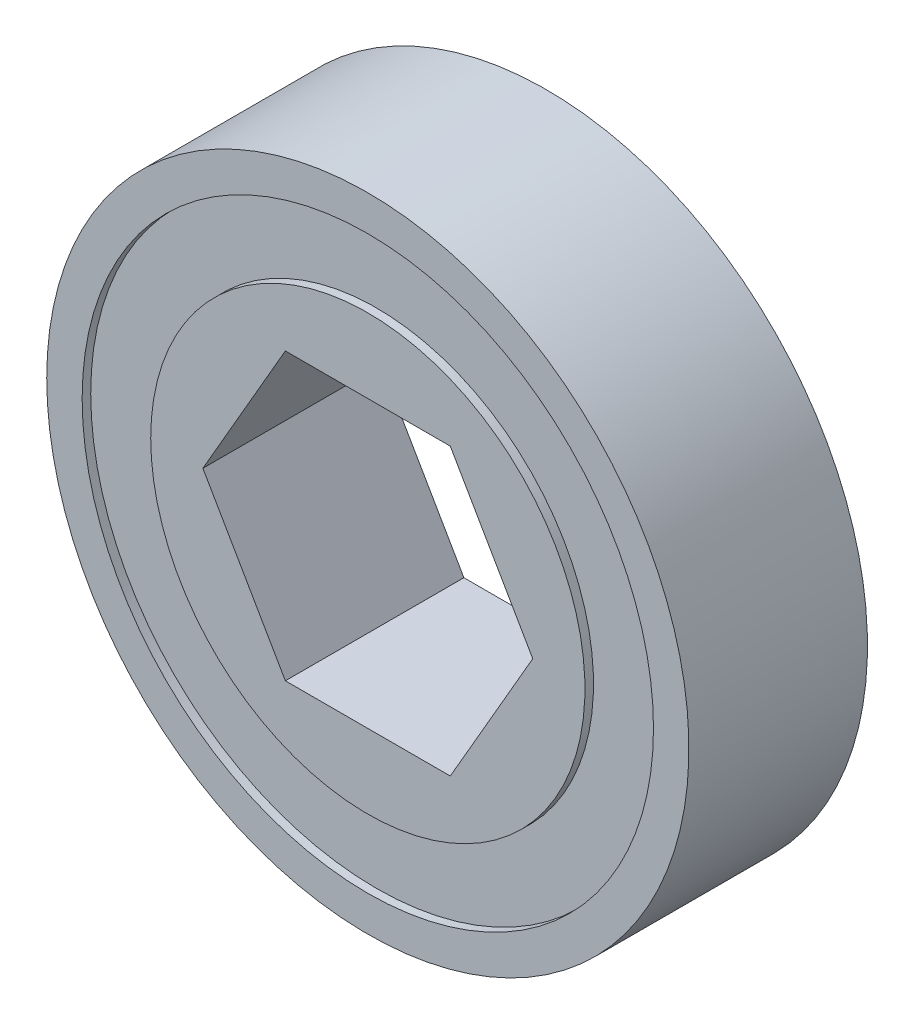
ISO-10303-21;
HEADER;
FILE_DESCRIPTION(('STEP AP214'),'2;1');
FILE_NAME('part.step','',(''),(''),'','','');
FILE_SCHEMA(('AUTOMOTIVE_DESIGN { 1 0 10303 214 1 1 1 1 }'));
ENDSEC;
DATA;
#1=APPLICATION_CONTEXT('core data for automotive mechanical design processes');
#2=APPLICATION_PROTOCOL_DEFINITION('international standard','automotive_design',2000,#1);
#3=PRODUCT_CONTEXT('',#1,'mechanical');
#4=PRODUCT('Part','Part','',(#3));
#5=PRODUCT_RELATED_PRODUCT_CATEGORY('part','',(#4));
#6=PRODUCT_DEFINITION_FORMATION('','',#4);
#7=PRODUCT_DEFINITION_CONTEXT('part definition',#1,'design');
#8=PRODUCT_DEFINITION('design','',#6,#7);
#9=PRODUCT_DEFINITION_SHAPE('','',#8);
#10=(LENGTH_UNIT() NAMED_UNIT(*) SI_UNIT(.MILLI.,.METRE.));
#11=(NAMED_UNIT(*) PLANE_ANGLE_UNIT() SI_UNIT($,.RADIAN.));
#12=(NAMED_UNIT(*) SI_UNIT($,.STERADIAN.) SOLID_ANGLE_UNIT());
#13=UNCERTAINTY_MEASURE_WITH_UNIT(LENGTH_MEASURE(1.E-05),#10,'distance_accuracy_value','');
#14=(GEOMETRIC_REPRESENTATION_CONTEXT(3) GLOBAL_UNCERTAINTY_ASSIGNED_CONTEXT((#13)) GLOBAL_UNIT_ASSIGNED_CONTEXT((#10,
#11,#12)) REPRESENTATION_CONTEXT('',''));
#15=CARTESIAN_POINT('',(0.,0.,0.));
#16=DIRECTION('',(0.,0.,1.));
#17=DIRECTION('',(1.,0.,0.));
#18=AXIS2_PLACEMENT_3D('',#15,#16,#17);
#19=CARTESIAN_POINT('',(9.652,0.,7.93750000000006));
#20=DIRECTION('',(0.,0.,-1.));
#21=DIRECTION('',(-1.,0.,0.));
#22=AXIS2_PLACEMENT_3D('',#19,#20,#21);
#23=PLANE('',#22);
#24=CARTESIAN_POINT('',(0.,0.,7.93750000000006));
#25=DIRECTION('',(0.,0.,-1.));
#26=DIRECTION('',(-1.,0.,0.));
#27=AXIS2_PLACEMENT_3D('',#24,#25,#26);
#28=CIRCLE('',#27,9.652);
#29=CARTESIAN_POINT('',(-9.652,0.,7.93750000000006));
#30=VERTEX_POINT('',#29);
#31=EDGE_CURVE('E141',#30,#30,#28,.T.);
#32=ORIENTED_EDGE('',*,*,#31,.F.);
#33=EDGE_LOOP('',(#32));
#34=FACE_BOUND('',#33,.T.);
#35=DIRECTION('',(-0.5,-0.866025403784439,0.));
#36=VECTOR('',#35,1.);
#37=CARTESIAN_POINT('',(-3.66617420935412,6.35,7.93750000000006));
#38=LINE('',#37,#36);
#39=CARTESIAN_POINT('',(-3.66617420935412,6.35,7.93750000000006));
#40=VERTEX_POINT('',#39);
#41=CARTESIAN_POINT('',(-7.33234841870825,0.,7.93750000000006));
#42=VERTEX_POINT('',#41);
#43=EDGE_CURVE('E85',#40,#42,#38,.T.);
#44=ORIENTED_EDGE('',*,*,#43,.F.);
#45=DIRECTION('',(-1.,0.,0.));
#46=VECTOR('',#45,1.);
#47=CARTESIAN_POINT('',(3.66617420935412,6.35,7.93750000000006));
#48=LINE('',#47,#46);
#49=CARTESIAN_POINT('',(3.66617420935412,6.35,7.93750000000006));
#50=VERTEX_POINT('',#49);
#51=EDGE_CURVE('E113',#50,#40,#48,.T.);
#52=ORIENTED_EDGE('',*,*,#51,.F.);
#53=DIRECTION('',(-0.5,0.866025403784439,0.));
#54=VECTOR('',#53,1.);
#55=CARTESIAN_POINT('',(7.33234841870825,0.,7.93750000000006));
#56=LINE('',#55,#54);
#57=CARTESIAN_POINT('',(7.33234841870825,0.,7.93750000000006));
#58=VERTEX_POINT('',#57);
#59=EDGE_CURVE('E111',#58,#50,#56,.T.);
#60=ORIENTED_EDGE('',*,*,#59,.F.);
#61=DIRECTION('',(0.5,0.866025403784439,0.));
#62=VECTOR('',#61,1.);
#63=CARTESIAN_POINT('',(3.66617420935412,-6.35,7.93750000000006));
#64=LINE('',#63,#62);
#65=CARTESIAN_POINT('',(3.66617420935412,-6.35,7.93750000000006));
#66=VERTEX_POINT('',#65);
#67=EDGE_CURVE('E107',#66,#58,#64,.T.);
#68=ORIENTED_EDGE('',*,*,#67,.F.);
#69=DIRECTION('',(1.,0.,0.));
#70=VECTOR('',#69,1.);
#71=CARTESIAN_POINT('',(-3.66617420935412,-6.35,7.93750000000006));
#72=LINE('',#71,#70);
#73=CARTESIAN_POINT('',(-3.66617420935412,-6.35,7.93750000000006));
#74=VERTEX_POINT('',#73);
#75=EDGE_CURVE('E105',#74,#66,#72,.T.);
#76=ORIENTED_EDGE('',*,*,#75,.F.);
#77=DIRECTION('',(0.5,-0.866025403784438,0.));
#78=VECTOR('',#77,1.);
#79=CARTESIAN_POINT('',(-7.33234841870825,0.,7.93750000000006));
#80=LINE('',#79,#78);
#81=EDGE_CURVE('E93',#42,#74,#80,.T.);
#82=ORIENTED_EDGE('',*,*,#81,.F.);
#83=EDGE_LOOP('',(#44,#52,#60,#68,#76,#82));
#84=FACE_BOUND('',#83,.T.);
#85=ADVANCED_FACE('F34',(#34,#84),#23,.F.);
#86=CARTESIAN_POINT('',(9.652,0.,0.));
#87=DIRECTION('',(0.,0.,1.));
#88=DIRECTION('',(1.,0.,0.));
#89=AXIS2_PLACEMENT_3D('',#86,#87,#88);
#90=PLANE('',#89);
#91=CARTESIAN_POINT('',(0.,0.,0.));
#92=DIRECTION('',(0.,0.,-1.));
#93=DIRECTION('',(-1.,0.,0.));
#94=AXIS2_PLACEMENT_3D('',#91,#92,#93);
#95=CIRCLE('',#94,9.652);
#96=CARTESIAN_POINT('',(-9.652,0.,0.));
#97=VERTEX_POINT('',#96);
#98=EDGE_CURVE('E138',#97,#97,#95,.T.);
#99=ORIENTED_EDGE('',*,*,#98,.T.);
#100=EDGE_LOOP('',(#99));
#101=FACE_BOUND('',#100,.T.);
#102=DIRECTION('',(0.5,0.866025403784439,0.));
#103=VECTOR('',#102,1.);
#104=CARTESIAN_POINT('',(-3.08626131403119,7.3544385986637,0.));
#105=LINE('',#104,#103);
#106=CARTESIAN_POINT('',(-7.33234841870825,0.,0.));
#107=VERTEX_POINT('',#106);
#108=CARTESIAN_POINT('',(-3.66617420935413,6.35,0.));
#109=VERTEX_POINT('',#108);
#110=EDGE_CURVE('E11',#107,#109,#105,.T.);
#111=ORIENTED_EDGE('',*,*,#110,.F.);
#112=DIRECTION('',(-0.5,0.866025403784439,0.));
#113=VECTOR('',#112,1.);
#114=CARTESIAN_POINT('',(-3.08626131403118,-7.3544385986637,0.));
#115=LINE('',#114,#113);
#116=CARTESIAN_POINT('',(-3.66617420935412,-6.35,0.));
#117=VERTEX_POINT('',#116);
#118=EDGE_CURVE('E42',#117,#107,#115,.T.);
#119=ORIENTED_EDGE('',*,*,#118,.F.);
#120=DIRECTION('',(-1.,0.,0.));
#121=VECTOR('',#120,1.);
#122=CARTESIAN_POINT('',(9.652,-6.35,0.));
#123=LINE('',#122,#121);
#124=CARTESIAN_POINT('',(3.66617420935412,-6.35,0.));
#125=VERTEX_POINT('',#124);
#126=EDGE_CURVE('E159',#125,#117,#123,.T.);
#127=ORIENTED_EDGE('',*,*,#126,.F.);
#128=DIRECTION('',(-0.5,-0.866025403784439,0.));
#129=VECTOR('',#128,1.);
#130=CARTESIAN_POINT('',(7.91226131403119,1.0044385986637,0.));
#131=LINE('',#130,#129);
#132=CARTESIAN_POINT('',(7.33234841870825,0.,0.));
#133=VERTEX_POINT('',#132);
#134=EDGE_CURVE('E157',#133,#125,#131,.T.);
#135=ORIENTED_EDGE('',*,*,#134,.F.);
#136=DIRECTION('',(0.5,-0.866025403784439,0.));
#137=VECTOR('',#136,1.);
#138=CARTESIAN_POINT('',(7.91226131403119,-1.0044385986637,0.));
#139=LINE('',#138,#137);
#140=CARTESIAN_POINT('',(3.66617420935412,6.35,0.));
#141=VERTEX_POINT('',#140);
#142=EDGE_CURVE('E155',#141,#133,#139,.T.);
#143=ORIENTED_EDGE('',*,*,#142,.F.);
#144=DIRECTION('',(1.,0.,0.));
#145=VECTOR('',#144,1.);
#146=CARTESIAN_POINT('',(9.652,6.35,0.));
#147=LINE('',#146,#145);
#148=EDGE_CURVE('E153',#109,#141,#147,.T.);
#149=ORIENTED_EDGE('',*,*,#148,.F.);
#150=EDGE_LOOP('',(#111,#119,#127,#135,#143,#149));
#151=FACE_BOUND('',#150,.T.);
#152=ADVANCED_FACE('F166',(#101,#151),#90,.F.);
#153=CARTESIAN_POINT('',(14.2748,0.,7.93750000000006));
#154=DIRECTION('',(0.,0.,-1.));
#155=DIRECTION('',(-1.,0.,0.));
#156=AXIS2_PLACEMENT_3D('',#153,#154,#155);
#157=PLANE('',#156);
#158=CARTESIAN_POINT('',(0.,0.,7.93750000000006));
#159=DIRECTION('',(0.,0.,-1.));
#160=DIRECTION('',(-1.,0.,0.));
#161=AXIS2_PLACEMENT_3D('',#158,#159,#160);
#162=CIRCLE('',#161,14.2748);
#163=CARTESIAN_POINT('',(-14.2748,0.,7.93750000000006));
#164=VERTEX_POINT('',#163);
#165=EDGE_CURVE('E100',#164,#164,#162,.T.);
#166=ORIENTED_EDGE('',*,*,#165,.F.);
#167=EDGE_LOOP('',(#166));
#168=FACE_BOUND('',#167,.T.);
#169=CARTESIAN_POINT('',(0.,0.,7.93750000000006));
#170=DIRECTION('',(0.,0.,-1.));
#171=DIRECTION('',(-1.,0.,0.));
#172=AXIS2_PLACEMENT_3D('',#169,#170,#171);
#173=CIRCLE('',#172,12.7);
#174=CARTESIAN_POINT('',(-12.7,0.,7.93750000000006));
#175=VERTEX_POINT('',#174);
#176=EDGE_CURVE('E150',#175,#175,#173,.T.);
#177=ORIENTED_EDGE('',*,*,#176,.T.);
#178=EDGE_LOOP('',(#177));
#179=FACE_BOUND('',#178,.T.);
#180=ADVANCED_FACE('F36',(#168,#179),#157,.F.);
#181=CARTESIAN_POINT('',(0.,0.,0.717728401684845));
#182=DIRECTION('',(0.,0.,-1.));
#183=DIRECTION('',(-1.,0.,0.));
#184=AXIS2_PLACEMENT_3D('',#181,#182,#183);
#185=CYLINDRICAL_SURFACE('',#184,12.7);
#186=ORIENTED_EDGE('',*,*,#176,.F.);
#187=EDGE_LOOP('',(#186));
#188=FACE_BOUND('',#187,.T.);
#189=CARTESIAN_POINT('',(0.,0.,7.55650000000006));
#190=DIRECTION('',(0.,0.,-1.));
#191=DIRECTION('',(-1.,0.,0.));
#192=AXIS2_PLACEMENT_3D('',#189,#190,#191);
#193=CIRCLE('',#192,12.7);
#194=CARTESIAN_POINT('',(-12.7,0.,7.55650000000006));
#195=VERTEX_POINT('',#194);
#196=EDGE_CURVE('E147',#195,#195,#193,.T.);
#197=ORIENTED_EDGE('',*,*,#196,.T.);
#198=EDGE_LOOP('',(#197));
#199=FACE_BOUND('',#198,.T.);
#200=ADVANCED_FACE('F202',(#188,#199),#185,.F.);
#201=CARTESIAN_POINT('',(12.7,0.,7.55650000000006));
#202=DIRECTION('',(0.,0.,-1.));
#203=DIRECTION('',(-1.,0.,0.));
#204=AXIS2_PLACEMENT_3D('',#201,#202,#203);
#205=PLANE('',#204);
#206=ORIENTED_EDGE('',*,*,#196,.F.);
#207=EDGE_LOOP('',(#206));
#208=FACE_BOUND('',#207,.T.);
#209=CARTESIAN_POINT('',(0.,0.,7.55650000000006));
#210=DIRECTION('',(0.,0.,-1.));
#211=DIRECTION('',(-1.,0.,0.));
#212=AXIS2_PLACEMENT_3D('',#209,#210,#211);
#213=CIRCLE('',#212,9.652);
#214=CARTESIAN_POINT('',(-9.652,0.,7.55650000000006));
#215=VERTEX_POINT('',#214);
#216=EDGE_CURVE('E144',#215,#215,#213,.T.);
#217=ORIENTED_EDGE('',*,*,#216,.T.);
#218=EDGE_LOOP('',(#217));
#219=FACE_BOUND('',#218,.T.);
#220=ADVANCED_FACE('F199',(#208,#219),#205,.F.);
#221=CARTESIAN_POINT('',(0.,0.,0.717728401684845));
#222=DIRECTION('',(0.,0.,-1.));
#223=DIRECTION('',(-1.,0.,0.));
#224=AXIS2_PLACEMENT_3D('',#221,#222,#223);
#225=CYLINDRICAL_SURFACE('',#224,9.652);
#226=ORIENTED_EDGE('',*,*,#216,.F.);
#227=EDGE_LOOP('',(#226));
#228=FACE_BOUND('',#227,.T.);
#229=ORIENTED_EDGE('',*,*,#31,.T.);
#230=EDGE_LOOP('',(#229));
#231=FACE_BOUND('',#230,.T.);
#232=ADVANCED_FACE('F195',(#228,#231),#225,.T.);
#233=CARTESIAN_POINT('',(0.,0.,0.717728401684845));
#234=DIRECTION('',(0.,0.,-1.));
#235=DIRECTION('',(-1.,0.,0.));
#236=AXIS2_PLACEMENT_3D('',#233,#234,#235);
#237=CYLINDRICAL_SURFACE('',#236,9.652);
#238=ORIENTED_EDGE('',*,*,#98,.F.);
#239=EDGE_LOOP('',(#238));
#240=FACE_BOUND('',#239,.T.);
#241=CARTESIAN_POINT('',(0.,0.,0.381));
#242=DIRECTION('',(0.,0.,-1.));
#243=DIRECTION('',(-1.,0.,0.));
#244=AXIS2_PLACEMENT_3D('',#241,#242,#243);
#245=CIRCLE('',#244,9.652);
#246=CARTESIAN_POINT('',(-9.652,0.,0.381));
#247=VERTEX_POINT('',#246);
#248=EDGE_CURVE('E135',#247,#247,#245,.T.);
#249=ORIENTED_EDGE('',*,*,#248,.T.);
#250=EDGE_LOOP('',(#249));
#251=FACE_BOUND('',#250,.T.);
#252=ADVANCED_FACE('F198',(#240,#251),#237,.T.);
#253=CARTESIAN_POINT('',(12.7,0.,0.381));
#254=DIRECTION('',(0.,0.,1.));
#255=DIRECTION('',(1.,0.,0.));
#256=AXIS2_PLACEMENT_3D('',#253,#254,#255);
#257=PLANE('',#256);
#258=ORIENTED_EDGE('',*,*,#248,.F.);
#259=EDGE_LOOP('',(#258));
#260=FACE_BOUND('',#259,.T.);
#261=CARTESIAN_POINT('',(0.,0.,0.381));
#262=DIRECTION('',(0.,0.,-1.));
#263=DIRECTION('',(-1.,0.,0.));
#264=AXIS2_PLACEMENT_3D('',#261,#262,#263);
#265=CIRCLE('',#264,12.7);
#266=CARTESIAN_POINT('',(-12.7,0.,0.381));
#267=VERTEX_POINT('',#266);
#268=EDGE_CURVE('E132',#267,#267,#265,.T.);
#269=ORIENTED_EDGE('',*,*,#268,.T.);
#270=EDGE_LOOP('',(#269));
#271=FACE_BOUND('',#270,.T.);
#272=ADVANCED_FACE('F239',(#260,#271),#257,.F.);
#273=CARTESIAN_POINT('',(0.,0.,0.717728401684845));
#274=DIRECTION('',(0.,0.,-1.));
#275=DIRECTION('',(-1.,0.,0.));
#276=AXIS2_PLACEMENT_3D('',#273,#274,#275);
#277=CYLINDRICAL_SURFACE('',#276,12.7);
#278=ORIENTED_EDGE('',*,*,#268,.F.);
#279=EDGE_LOOP('',(#278));
#280=FACE_BOUND('',#279,.T.);
#281=CARTESIAN_POINT('',(0.,0.,0.));
#282=DIRECTION('',(0.,0.,-1.));
#283=DIRECTION('',(-1.,0.,0.));
#284=AXIS2_PLACEMENT_3D('',#281,#282,#283);
#285=CIRCLE('',#284,12.7);
#286=CARTESIAN_POINT('',(-12.7,0.,0.));
#287=VERTEX_POINT('',#286);
#288=EDGE_CURVE('E129',#287,#287,#285,.T.);
#289=ORIENTED_EDGE('',*,*,#288,.T.);
#290=EDGE_LOOP('',(#289));
#291=FACE_BOUND('',#290,.T.);
#292=ADVANCED_FACE('F231',(#280,#291),#277,.F.);
#293=CARTESIAN_POINT('',(12.7,0.,0.));
#294=DIRECTION('',(0.,0.,1.));
#295=DIRECTION('',(1.,0.,0.));
#296=AXIS2_PLACEMENT_3D('',#293,#294,#295);
#297=PLANE('',#296);
#298=ORIENTED_EDGE('',*,*,#288,.F.);
#299=EDGE_LOOP('',(#298));
#300=FACE_BOUND('',#299,.T.);
#301=CARTESIAN_POINT('',(0.,0.,0.));
#302=DIRECTION('',(0.,0.,-1.));
#303=DIRECTION('',(-1.,0.,0.));
#304=AXIS2_PLACEMENT_3D('',#301,#302,#303);
#305=CIRCLE('',#304,14.2748);
#306=CARTESIAN_POINT('',(-14.2748,0.,0.));
#307=VERTEX_POINT('',#306);
#308=EDGE_CURVE('E126',#307,#307,#305,.T.);
#309=ORIENTED_EDGE('',*,*,#308,.T.);
#310=EDGE_LOOP('',(#309));
#311=FACE_BOUND('',#310,.T.);
#312=ADVANCED_FACE('F223',(#300,#311),#297,.F.);
#313=CARTESIAN_POINT('',(0.,0.,0.717728401684845));
#314=DIRECTION('',(0.,0.,-1.));
#315=DIRECTION('',(-1.,0.,0.));
#316=AXIS2_PLACEMENT_3D('',#313,#314,#315);
#317=CYLINDRICAL_SURFACE('',#316,14.2748);
#318=ORIENTED_EDGE('',*,*,#308,.F.);
#319=EDGE_LOOP('',(#318));
#320=FACE_BOUND('',#319,.T.);
#321=ORIENTED_EDGE('',*,*,#165,.T.);
#322=EDGE_LOOP('',(#321));
#323=FACE_BOUND('',#322,.T.);
#324=ADVANCED_FACE('F221',(#320,#323),#317,.T.);
#325=CARTESIAN_POINT('',(-3.66617420935412,6.35,7.93750000000006));
#326=DIRECTION('',(0.866025403784439,-0.5,0.));
#327=DIRECTION('',(0.5,0.866025403784439,0.));
#328=AXIS2_PLACEMENT_3D('',#325,#326,#327);
#329=PLANE('',#328);
#330=ORIENTED_EDGE('',*,*,#110,.T.);
#331=DIRECTION('',(0.,0.,-1.));
#332=VECTOR('',#331,1.);
#333=CARTESIAN_POINT('',(-3.66617420935412,6.35,7.93750000000006));
#334=LINE('',#333,#332);
#335=EDGE_CURVE('E54',#40,#109,#334,.T.);
#336=ORIENTED_EDGE('',*,*,#335,.F.);
#337=ORIENTED_EDGE('',*,*,#43,.T.);
#338=DIRECTION('',(0.,0.,-1.));
#339=VECTOR('',#338,1.);
#340=CARTESIAN_POINT('',(-7.33234841870825,0.,7.93750000000006));
#341=LINE('',#340,#339);
#342=EDGE_CURVE('E88',#42,#107,#341,.T.);
#343=ORIENTED_EDGE('',*,*,#342,.T.);
#344=EDGE_LOOP('',(#330,#336,#337,#343));
#345=FACE_BOUND('',#344,.T.);
#346=ADVANCED_FACE('F87',(#345),#329,.T.);
#347=CARTESIAN_POINT('',(-7.33234841870825,0.,7.93750000000006));
#348=DIRECTION('',(0.866025403784439,0.5,0.));
#349=DIRECTION('',(-0.5,0.866025403784439,0.));
#350=AXIS2_PLACEMENT_3D('',#347,#348,#349);
#351=PLANE('',#350);
#352=ORIENTED_EDGE('',*,*,#118,.T.);
#353=ORIENTED_EDGE('',*,*,#342,.F.);
#354=ORIENTED_EDGE('',*,*,#81,.T.);
#355=DIRECTION('',(0.,0.,-1.));
#356=VECTOR('',#355,1.);
#357=CARTESIAN_POINT('',(-3.66617420935412,-6.35,7.93750000000006));
#358=LINE('',#357,#356);
#359=EDGE_CURVE('E101',#74,#117,#358,.T.);
#360=ORIENTED_EDGE('',*,*,#359,.T.);
#361=EDGE_LOOP('',(#352,#353,#354,#360));
#362=FACE_BOUND('',#361,.T.);
#363=ADVANCED_FACE('F96',(#362),#351,.T.);
#364=CARTESIAN_POINT('',(-3.66617420935412,-6.35,7.93750000000006));
#365=DIRECTION('',(0.,1.,0.));
#366=DIRECTION('',(0.,0.,1.));
#367=AXIS2_PLACEMENT_3D('',#364,#365,#366);
#368=PLANE('',#367);
#369=ORIENTED_EDGE('',*,*,#126,.T.);
#370=ORIENTED_EDGE('',*,*,#359,.F.);
#371=ORIENTED_EDGE('',*,*,#75,.T.);
#372=DIRECTION('',(0.,0.,-1.));
#373=VECTOR('',#372,1.);
#374=CARTESIAN_POINT('',(3.66617420935412,-6.35,7.93750000000006));
#375=LINE('',#374,#373);
#376=EDGE_CURVE('E120',#66,#125,#375,.T.);
#377=ORIENTED_EDGE('',*,*,#376,.T.);
#378=EDGE_LOOP('',(#369,#370,#371,#377));
#379=FACE_BOUND('',#378,.T.);
#380=ADVANCED_FACE('F162',(#379),#368,.T.);
#381=CARTESIAN_POINT('',(3.66617420935412,-6.35,7.93750000000006));
#382=DIRECTION('',(-0.866025403784439,0.5,0.));
#383=DIRECTION('',(-0.5,-0.866025403784439,0.));
#384=AXIS2_PLACEMENT_3D('',#381,#382,#383);
#385=PLANE('',#384);
#386=ORIENTED_EDGE('',*,*,#134,.T.);
#387=ORIENTED_EDGE('',*,*,#376,.F.);
#388=ORIENTED_EDGE('',*,*,#67,.T.);
#389=DIRECTION('',(0.,0.,-1.));
#390=VECTOR('',#389,1.);
#391=CARTESIAN_POINT('',(7.33234841870825,0.,7.93750000000006));
#392=LINE('',#391,#390);
#393=EDGE_CURVE('E117',#58,#133,#392,.T.);
#394=ORIENTED_EDGE('',*,*,#393,.T.);
#395=EDGE_LOOP('',(#386,#387,#388,#394));
#396=FACE_BOUND('',#395,.T.);
#397=ADVANCED_FACE('F175',(#396),#385,.T.);
#398=CARTESIAN_POINT('',(7.33234841870825,0.,7.93750000000006));
#399=DIRECTION('',(-0.866025403784439,-0.5,0.));
#400=DIRECTION('',(0.5,-0.866025403784439,0.));
#401=AXIS2_PLACEMENT_3D('',#398,#399,#400);
#402=PLANE('',#401);
#403=ORIENTED_EDGE('',*,*,#142,.T.);
#404=ORIENTED_EDGE('',*,*,#393,.F.);
#405=ORIENTED_EDGE('',*,*,#59,.T.);
#406=DIRECTION('',(0.,0.,-1.));
#407=VECTOR('',#406,1.);
#408=CARTESIAN_POINT('',(3.66617420935412,6.35,7.93750000000006));
#409=LINE('',#408,#407);
#410=EDGE_CURVE('E49',#50,#141,#409,.T.);
#411=ORIENTED_EDGE('',*,*,#410,.T.);
#412=EDGE_LOOP('',(#403,#404,#405,#411));
#413=FACE_BOUND('',#412,.T.);
#414=ADVANCED_FACE('F171',(#413),#402,.T.);
#415=CARTESIAN_POINT('',(3.66617420935412,6.35,7.93750000000006));
#416=DIRECTION('',(0.,-1.,0.));
#417=DIRECTION('',(0.,0.,-1.));
#418=AXIS2_PLACEMENT_3D('',#415,#416,#417);
#419=PLANE('',#418);
#420=ORIENTED_EDGE('',*,*,#148,.T.);
#421=ORIENTED_EDGE('',*,*,#410,.F.);
#422=ORIENTED_EDGE('',*,*,#51,.T.);
#423=ORIENTED_EDGE('',*,*,#335,.T.);
#424=EDGE_LOOP('',(#420,#421,#422,#423));
#425=FACE_BOUND('',#424,.T.);
#426=ADVANCED_FACE('F169',(#425),#419,.T.);
#427=CLOSED_SHELL('',(#85,#152,#180,#200,#220,#232,#252,#272,#292,#312,#324,#346,#363,#380,#397,
#414,#426));
#428=MANIFOLD_SOLID_BREP('B2',#427);
#429=ADVANCED_BREP_SHAPE_REPRESENTATION('',(#18,#428),#14);
#430=SHAPE_DEFINITION_REPRESENTATION(#9,#429);
ENDSEC;
END-ISO-10303-21;
